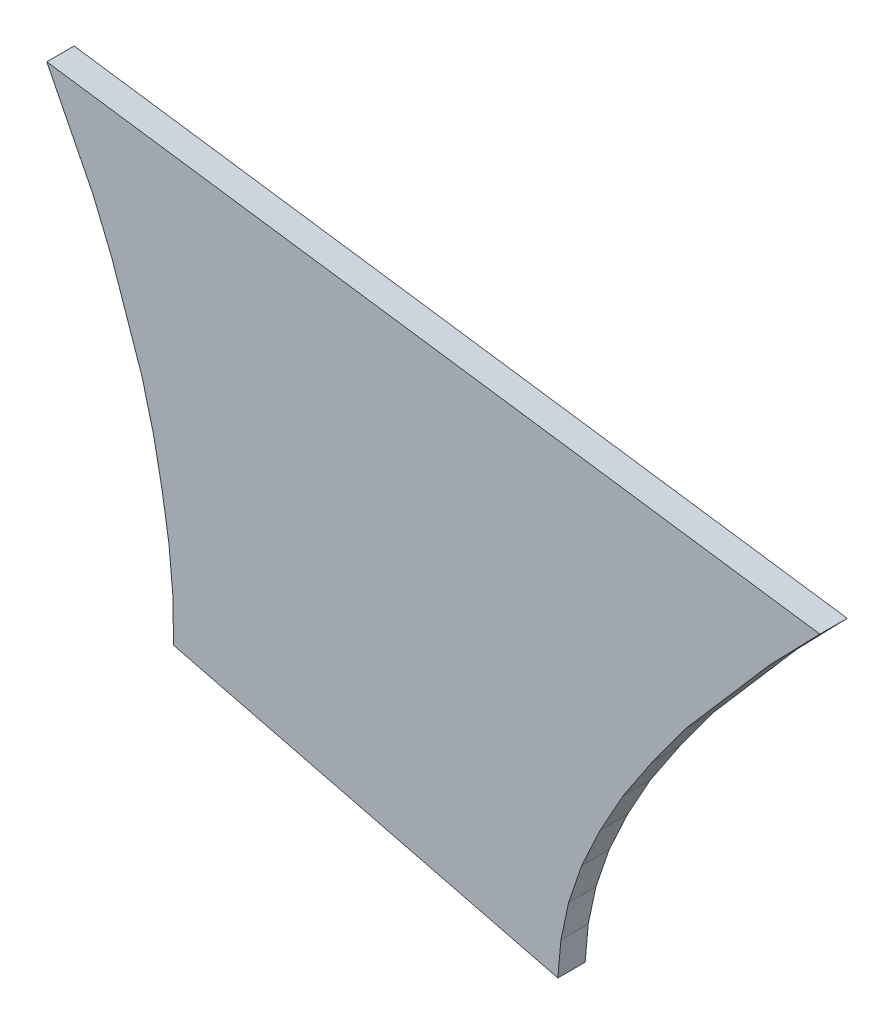
ISO-10303-21;
HEADER;
FILE_DESCRIPTION(('STEP AP214'),'2;1');
FILE_NAME('part.step','',(''),(''),'','','');
FILE_SCHEMA(('AUTOMOTIVE_DESIGN { 1 0 10303 214 1 1 1 1 }'));
ENDSEC;
DATA;
#1=APPLICATION_CONTEXT('core data for automotive mechanical design processes');
#2=APPLICATION_PROTOCOL_DEFINITION('international standard','automotive_design',2000,#1);
#3=PRODUCT_CONTEXT('',#1,'mechanical');
#4=PRODUCT('Part','Part','',(#3));
#5=PRODUCT_RELATED_PRODUCT_CATEGORY('part','',(#4));
#6=PRODUCT_DEFINITION_FORMATION('','',#4);
#7=PRODUCT_DEFINITION_CONTEXT('part definition',#1,'design');
#8=PRODUCT_DEFINITION('design','',#6,#7);
#9=PRODUCT_DEFINITION_SHAPE('','',#8);
#10=(LENGTH_UNIT() NAMED_UNIT(*) SI_UNIT(.MILLI.,.METRE.));
#11=(NAMED_UNIT(*) PLANE_ANGLE_UNIT() SI_UNIT($,.RADIAN.));
#12=(NAMED_UNIT(*) SI_UNIT($,.STERADIAN.) SOLID_ANGLE_UNIT());
#13=UNCERTAINTY_MEASURE_WITH_UNIT(LENGTH_MEASURE(1.E-05),#10,'distance_accuracy_value','');
#14=(GEOMETRIC_REPRESENTATION_CONTEXT(3) GLOBAL_UNCERTAINTY_ASSIGNED_CONTEXT((#13)) GLOBAL_UNIT_ASSIGNED_CONTEXT((#10,
#11,#12)) REPRESENTATION_CONTEXT('',''));
#15=CARTESIAN_POINT('',(0.,0.,0.));
#16=DIRECTION('',(0.,0.,1.));
#17=DIRECTION('',(1.,0.,0.));
#18=AXIS2_PLACEMENT_3D('',#15,#16,#17);
#19=CARTESIAN_POINT('',(89.1480026245117,104.810997009277,0.));
#20=DIRECTION('',(-0.996077933740021,0.0884802233056062,0.));
#21=DIRECTION('',(0.0884802233056062,0.996077933740021,0.));
#22=AXIS2_PLACEMENT_3D('',#19,#20,#21);
#23=PLANE('',#22);
#24=DIRECTION('',(0.0884802233056062,0.996077933740021,0.));
#25=VECTOR('',#24,1.);
#26=CARTESIAN_POINT('',(89.1480026245117,104.810997009277,0.03556));
#27=LINE('',#26,#25);
#28=CARTESIAN_POINT('',(89.1480026245117,104.810997009277,0.03556));
#29=VERTEX_POINT('',#28);
#30=CARTESIAN_POINT('',(89.1520004272461,104.856002807617,0.03556));
#31=VERTEX_POINT('',#30);
#32=EDGE_CURVE('E11',#29,#31,#27,.T.);
#33=ORIENTED_EDGE('',*,*,#32,.F.);
#34=DIRECTION('',(0.,0.,1.));
#35=VECTOR('',#34,1.);
#36=CARTESIAN_POINT('',(89.1480026245117,104.810997009277,0.));
#37=LINE('',#36,#35);
#38=CARTESIAN_POINT('',(89.1480026245117,104.810997009277,0.));
#39=VERTEX_POINT('',#38);
#40=EDGE_CURVE('E24',#39,#29,#37,.T.);
#41=ORIENTED_EDGE('',*,*,#40,.F.);
#42=DIRECTION('',(0.0884802233056062,0.996077933740021,0.));
#43=VECTOR('',#42,1.);
#44=CARTESIAN_POINT('',(89.1480026245117,104.810997009277,0.));
#45=LINE('',#44,#43);
#46=CARTESIAN_POINT('',(89.1520004272461,104.856002807617,0.));
#47=VERTEX_POINT('',#46);
#48=EDGE_CURVE('E166',#39,#47,#45,.T.);
#49=ORIENTED_EDGE('',*,*,#48,.T.);
#50=DIRECTION('',(0.,0.,1.));
#51=VECTOR('',#50,1.);
#52=CARTESIAN_POINT('',(89.1520004272461,104.856002807617,0.));
#53=LINE('',#52,#51);
#54=EDGE_CURVE('E37',#47,#31,#53,.T.);
#55=ORIENTED_EDGE('',*,*,#54,.T.);
#56=EDGE_LOOP('',(#33,#41,#49,#55));
#57=FACE_BOUND('',#56,.T.);
#58=ADVANCED_FACE('F17',(#57),#23,.F.);
#59=CARTESIAN_POINT('',(89.1520004272461,104.856002807617,0.));
#60=DIRECTION('',(-0.978094237159911,0.208162588460494,0.));
#61=DIRECTION('',(0.208162588460494,0.978094237159911,0.));
#62=AXIS2_PLACEMENT_3D('',#59,#60,#61);
#63=PLANE('',#62);
#64=DIRECTION('',(0.208162588460494,0.978094237159911,0.));
#65=VECTOR('',#64,1.);
#66=CARTESIAN_POINT('',(89.1520004272461,104.856002807617,0.03556));
#67=LINE('',#66,#65);
#68=CARTESIAN_POINT('',(89.1620025634766,104.90299987793,0.03556));
#69=VERTEX_POINT('',#68);
#70=EDGE_CURVE('E294',#31,#69,#67,.T.);
#71=ORIENTED_EDGE('',*,*,#70,.F.);
#72=ORIENTED_EDGE('',*,*,#54,.F.);
#73=DIRECTION('',(0.208162588460494,0.978094237159911,0.));
#74=VECTOR('',#73,1.);
#75=CARTESIAN_POINT('',(89.1520004272461,104.856002807617,0.));
#76=LINE('',#75,#74);
#77=CARTESIAN_POINT('',(89.1620025634766,104.90299987793,0.));
#78=VERTEX_POINT('',#77);
#79=EDGE_CURVE('E291',#47,#78,#76,.T.);
#80=ORIENTED_EDGE('',*,*,#79,.T.);
#81=DIRECTION('',(0.,0.,1.));
#82=VECTOR('',#81,1.);
#83=CARTESIAN_POINT('',(89.1620025634766,104.90299987793,0.));
#84=LINE('',#83,#82);
#85=EDGE_CURVE('E289',#78,#69,#84,.T.);
#86=ORIENTED_EDGE('',*,*,#85,.T.);
#87=EDGE_LOOP('',(#71,#72,#80,#86));
#88=FACE_BOUND('',#87,.T.);
#89=ADVANCED_FACE('F302',(#88),#63,.F.);
#90=CARTESIAN_POINT('',(89.1620025634766,104.90299987793,0.));
#91=DIRECTION('',(-0.946788593315352,0.321856116250626,0.));
#92=DIRECTION('',(0.321856116250626,0.946788593315352,0.));
#93=AXIS2_PLACEMENT_3D('',#90,#91,#92);
#94=PLANE('',#93);
#95=DIRECTION('',(0.321856116250626,0.946788593315352,0.));
#96=VECTOR('',#95,1.);
#97=CARTESIAN_POINT('',(89.1620025634766,104.90299987793,0.03556));
#98=LINE('',#97,#96);
#99=CARTESIAN_POINT('',(89.1790008544922,104.953002929688,0.03556));
#100=VERTEX_POINT('',#99);
#101=EDGE_CURVE('E286',#69,#100,#98,.T.);
#102=ORIENTED_EDGE('',*,*,#101,.F.);
#103=ORIENTED_EDGE('',*,*,#85,.F.);
#104=DIRECTION('',(0.321856116250626,0.946788593315352,0.));
#105=VECTOR('',#104,1.);
#106=CARTESIAN_POINT('',(89.1620025634766,104.90299987793,0.));
#107=LINE('',#106,#105);
#108=CARTESIAN_POINT('',(89.1790008544922,104.953002929688,0.));
#109=VERTEX_POINT('',#108);
#110=EDGE_CURVE('E283',#78,#109,#107,.T.);
#111=ORIENTED_EDGE('',*,*,#110,.T.);
#112=DIRECTION('',(0.,0.,1.));
#113=VECTOR('',#112,1.);
#114=CARTESIAN_POINT('',(89.1790008544922,104.953002929688,0.));
#115=LINE('',#114,#113);
#116=EDGE_CURVE('E281',#109,#100,#115,.T.);
#117=ORIENTED_EDGE('',*,*,#116,.T.);
#118=EDGE_LOOP('',(#102,#103,#111,#117));
#119=FACE_BOUND('',#118,.T.);
#120=ADVANCED_FACE('F308',(#119),#94,.F.);
#121=CARTESIAN_POINT('',(89.1790008544922,104.953002929688,0.));
#122=DIRECTION('',(-0.907928187844985,0.419125763603863,0.));
#123=DIRECTION('',(0.419125763603863,0.907928187844985,0.));
#124=AXIS2_PLACEMENT_3D('',#121,#122,#123);
#125=PLANE('',#124);
#126=DIRECTION('',(0.419125763603863,0.907928187844985,0.));
#127=VECTOR('',#126,1.);
#128=CARTESIAN_POINT('',(89.1790008544922,104.953002929688,0.03556));
#129=LINE('',#128,#127);
#130=CARTESIAN_POINT('',(89.2030029296875,105.004997253418,0.03556));
#131=VERTEX_POINT('',#130);
#132=EDGE_CURVE('E278',#100,#131,#129,.T.);
#133=ORIENTED_EDGE('',*,*,#132,.F.);
#134=ORIENTED_EDGE('',*,*,#116,.F.);
#135=DIRECTION('',(0.419125763603863,0.907928187844985,0.));
#136=VECTOR('',#135,1.);
#137=CARTESIAN_POINT('',(89.1790008544922,104.953002929688,0.));
#138=LINE('',#137,#136);
#139=CARTESIAN_POINT('',(89.2030029296875,105.004997253418,0.));
#140=VERTEX_POINT('',#139);
#141=EDGE_CURVE('E275',#109,#140,#138,.T.);
#142=ORIENTED_EDGE('',*,*,#141,.T.);
#143=DIRECTION('',(0.,0.,1.));
#144=VECTOR('',#143,1.);
#145=CARTESIAN_POINT('',(89.2030029296875,105.004997253418,0.));
#146=LINE('',#145,#144);
#147=EDGE_CURVE('E273',#140,#131,#146,.T.);
#148=ORIENTED_EDGE('',*,*,#147,.T.);
#149=EDGE_LOOP('',(#133,#134,#142,#148));
#150=FACE_BOUND('',#149,.T.);
#151=ADVANCED_FACE('F310',(#150),#125,.F.);
#152=CARTESIAN_POINT('',(89.2030029296875,105.004997253418,0.));
#153=DIRECTION('',(-0.874168927292209,0.485621958478803,0.));
#154=DIRECTION('',(0.485621958478803,0.874168927292209,0.));
#155=AXIS2_PLACEMENT_3D('',#152,#153,#154);
#156=PLANE('',#155);
#157=DIRECTION('',(0.485621958478803,0.874168927292209,0.));
#158=VECTOR('',#157,1.);
#159=CARTESIAN_POINT('',(89.2030029296875,105.004997253418,0.03556));
#160=LINE('',#159,#158);
#161=CARTESIAN_POINT('',(89.2330017089844,105.05899810791,0.03556));
#162=VERTEX_POINT('',#161);
#163=EDGE_CURVE('E270',#131,#162,#160,.T.);
#164=ORIENTED_EDGE('',*,*,#163,.F.);
#165=ORIENTED_EDGE('',*,*,#147,.F.);
#166=DIRECTION('',(0.485621958478803,0.874168927292209,0.));
#167=VECTOR('',#166,1.);
#168=CARTESIAN_POINT('',(89.2030029296875,105.004997253418,0.));
#169=LINE('',#168,#167);
#170=CARTESIAN_POINT('',(89.2330017089844,105.05899810791,0.));
#171=VERTEX_POINT('',#170);
#172=EDGE_CURVE('E267',#140,#171,#169,.T.);
#173=ORIENTED_EDGE('',*,*,#172,.T.);
#174=DIRECTION('',(0.,0.,1.));
#175=VECTOR('',#174,1.);
#176=CARTESIAN_POINT('',(89.2330017089844,105.05899810791,0.));
#177=LINE('',#176,#175);
#178=EDGE_CURVE('E265',#171,#162,#177,.T.);
#179=ORIENTED_EDGE('',*,*,#178,.T.);
#180=EDGE_LOOP('',(#164,#165,#173,#179));
#181=FACE_BOUND('',#180,.T.);
#182=ADVANCED_FACE('F315',(#181),#156,.F.);
#183=CARTESIAN_POINT('',(89.2330017089844,105.05899810791,0.));
#184=DIRECTION('',(-0.83203316034414,0.554725896355797,0.));
#185=DIRECTION('',(0.554725896355797,0.83203316034414,0.));
#186=AXIS2_PLACEMENT_3D('',#183,#184,#185);
#187=PLANE('',#186);
#188=DIRECTION('',(0.554725896355797,0.83203316034414,0.));
#189=VECTOR('',#188,1.);
#190=CARTESIAN_POINT('',(89.2330017089844,105.05899810791,0.03556));
#191=LINE('',#190,#189);
#192=CARTESIAN_POINT('',(89.2710037231445,105.115997314453,0.03556));
#193=VERTEX_POINT('',#192);
#194=EDGE_CURVE('E262',#162,#193,#191,.T.);
#195=ORIENTED_EDGE('',*,*,#194,.F.);
#196=ORIENTED_EDGE('',*,*,#178,.F.);
#197=DIRECTION('',(0.554725896355797,0.83203316034414,0.));
#198=VECTOR('',#197,1.);
#199=CARTESIAN_POINT('',(89.2330017089844,105.05899810791,0.));
#200=LINE('',#199,#198);
#201=CARTESIAN_POINT('',(89.2710037231445,105.115997314453,0.));
#202=VERTEX_POINT('',#201);
#203=EDGE_CURVE('E259',#171,#202,#200,.T.);
#204=ORIENTED_EDGE('',*,*,#203,.T.);
#205=DIRECTION('',(0.,0.,1.));
#206=VECTOR('',#205,1.);
#207=CARTESIAN_POINT('',(89.2710037231445,105.115997314453,0.));
#208=LINE('',#207,#206);
#209=EDGE_CURVE('E257',#202,#193,#208,.T.);
#210=ORIENTED_EDGE('',*,*,#209,.T.);
#211=EDGE_LOOP('',(#195,#196,#204,#210));
#212=FACE_BOUND('',#211,.T.);
#213=ADVANCED_FACE('F318',(#212),#187,.F.);
#214=CARTESIAN_POINT('',(89.2710037231445,105.115997314453,0.));
#215=DIRECTION('',(-0.806437592455541,0.591319211149537,0.));
#216=DIRECTION('',(0.591319211149537,0.806437592455541,0.));
#217=AXIS2_PLACEMENT_3D('',#214,#215,#216);
#218=PLANE('',#217);
#219=DIRECTION('',(0.591319211149537,0.806437592455541,0.));
#220=VECTOR('',#219,1.);
#221=CARTESIAN_POINT('',(89.2710037231445,105.115997314453,0.03556));
#222=LINE('',#221,#220);
#223=CARTESIAN_POINT('',(89.3150024414062,105.176002502441,0.03556));
#224=VERTEX_POINT('',#223);
#225=EDGE_CURVE('E254',#193,#224,#222,.T.);
#226=ORIENTED_EDGE('',*,*,#225,.F.);
#227=ORIENTED_EDGE('',*,*,#209,.F.);
#228=DIRECTION('',(0.591319211149537,0.806437592455541,0.));
#229=VECTOR('',#228,1.);
#230=CARTESIAN_POINT('',(89.2710037231445,105.115997314453,0.));
#231=LINE('',#230,#229);
#232=CARTESIAN_POINT('',(89.3150024414062,105.176002502441,0.));
#233=VERTEX_POINT('',#232);
#234=EDGE_CURVE('E251',#202,#233,#231,.T.);
#235=ORIENTED_EDGE('',*,*,#234,.T.);
#236=DIRECTION('',(0.,0.,1.));
#237=VECTOR('',#236,1.);
#238=CARTESIAN_POINT('',(89.3150024414062,105.176002502441,0.));
#239=LINE('',#238,#237);
#240=EDGE_CURVE('E249',#233,#224,#239,.T.);
#241=ORIENTED_EDGE('',*,*,#240,.T.);
#242=EDGE_LOOP('',(#226,#227,#235,#241));
#243=FACE_BOUND('',#242,.T.);
#244=ADVANCED_FACE('F323',(#243),#218,.F.);
#245=CARTESIAN_POINT('',(89.3150024414062,105.176002502441,0.));
#246=DIRECTION('',(-0.756278047346252,0.654250345893787,0.));
#247=DIRECTION('',(0.654250345893787,0.756278047346252,0.));
#248=AXIS2_PLACEMENT_3D('',#245,#246,#247);
#249=PLANE('',#248);
#250=DIRECTION('',(0.654250345893787,0.756278047346252,0.));
#251=VECTOR('',#250,1.);
#252=CARTESIAN_POINT('',(89.3150024414062,105.176002502441,0.03556));
#253=LINE('',#252,#251);
#254=CARTESIAN_POINT('',(89.4240036010742,105.302001953125,0.03556));
#255=VERTEX_POINT('',#254);
#256=EDGE_CURVE('E246',#224,#255,#253,.T.);
#257=ORIENTED_EDGE('',*,*,#256,.F.);
#258=ORIENTED_EDGE('',*,*,#240,.F.);
#259=DIRECTION('',(0.654250345893787,0.756278047346252,0.));
#260=VECTOR('',#259,1.);
#261=CARTESIAN_POINT('',(89.3150024414062,105.176002502441,0.));
#262=LINE('',#261,#260);
#263=CARTESIAN_POINT('',(89.4240036010742,105.302001953125,0.));
#264=VERTEX_POINT('',#263);
#265=EDGE_CURVE('E243',#233,#264,#262,.T.);
#266=ORIENTED_EDGE('',*,*,#265,.T.);
#267=DIRECTION('',(0.,0.,1.));
#268=VECTOR('',#267,1.);
#269=CARTESIAN_POINT('',(89.4240036010742,105.302001953125,0.));
#270=LINE('',#269,#268);
#271=EDGE_CURVE('E241',#264,#255,#270,.T.);
#272=ORIENTED_EDGE('',*,*,#271,.T.);
#273=EDGE_LOOP('',(#257,#258,#266,#272));
#274=FACE_BOUND('',#273,.T.);
#275=ADVANCED_FACE('F326',(#274),#249,.F.);
#276=CARTESIAN_POINT('',(89.4240036010742,105.302001953125,0.));
#277=DIRECTION('',(-0.71777288988445,0.696277300037079,0.));
#278=DIRECTION('',(0.696277300037079,0.71777288988445,0.));
#279=AXIS2_PLACEMENT_3D('',#276,#277,#278);
#280=PLANE('',#279);
#281=DIRECTION('',(0.696277300037079,0.71777288988445,0.));
#282=VECTOR('',#281,1.);
#283=CARTESIAN_POINT('',(89.4240036010742,105.302001953125,0.03556));
#284=LINE('',#283,#282);
#285=CARTESIAN_POINT('',(89.4889984130859,105.369003295898,0.03556));
#286=VERTEX_POINT('',#285);
#287=EDGE_CURVE('E238',#255,#286,#284,.T.);
#288=ORIENTED_EDGE('',*,*,#287,.F.);
#289=ORIENTED_EDGE('',*,*,#271,.F.);
#290=DIRECTION('',(0.696277300037079,0.71777288988445,0.));
#291=VECTOR('',#290,1.);
#292=CARTESIAN_POINT('',(89.4240036010742,105.302001953125,0.));
#293=LINE('',#292,#291);
#294=CARTESIAN_POINT('',(89.4889984130859,105.369003295898,0.));
#295=VERTEX_POINT('',#294);
#296=EDGE_CURVE('E235',#264,#295,#293,.T.);
#297=ORIENTED_EDGE('',*,*,#296,.T.);
#298=DIRECTION('',(0.,0.,1.));
#299=VECTOR('',#298,1.);
#300=CARTESIAN_POINT('',(89.4889984130859,105.369003295898,0.));
#301=LINE('',#300,#299);
#302=EDGE_CURVE('E233',#295,#286,#301,.T.);
#303=ORIENTED_EDGE('',*,*,#302,.T.);
#304=EDGE_LOOP('',(#288,#289,#297,#303));
#305=FACE_BOUND('',#304,.T.);
#306=ADVANCED_FACE('F331',(#305),#280,.F.);
#307=CARTESIAN_POINT('',(89.4889984130859,105.369003295898,0.));
#308=DIRECTION('',(-0.139766370487865,-0.990184508907632,0.));
#309=DIRECTION('',(-0.990184508907632,0.139766370487865,0.));
#310=AXIS2_PLACEMENT_3D('',#307,#308,#309);
#311=PLANE('',#310);
#312=DIRECTION('',(-0.990184508907632,0.139766370487865,0.));
#313=VECTOR('',#312,1.);
#314=CARTESIAN_POINT('',(89.4889984130859,105.369003295898,0.03556));
#315=LINE('',#314,#313);
#316=CARTESIAN_POINT('',(88.4830017089844,105.511001586914,0.03556));
#317=VERTEX_POINT('',#316);
#318=EDGE_CURVE('E230',#286,#317,#315,.T.);
#319=ORIENTED_EDGE('',*,*,#318,.F.);
#320=ORIENTED_EDGE('',*,*,#302,.F.);
#321=DIRECTION('',(-0.990184508907632,0.139766370487865,0.));
#322=VECTOR('',#321,1.);
#323=CARTESIAN_POINT('',(89.4889984130859,105.369003295898,0.));
#324=LINE('',#323,#322);
#325=CARTESIAN_POINT('',(88.4830017089844,105.511001586914,0.));
#326=VERTEX_POINT('',#325);
#327=EDGE_CURVE('E227',#295,#326,#324,.T.);
#328=ORIENTED_EDGE('',*,*,#327,.T.);
#329=DIRECTION('',(0.,0.,1.));
#330=VECTOR('',#329,1.);
#331=CARTESIAN_POINT('',(88.4830017089844,105.511001586914,0.));
#332=LINE('',#331,#330);
#333=EDGE_CURVE('E225',#326,#317,#332,.T.);
#334=ORIENTED_EDGE('',*,*,#333,.T.);
#335=EDGE_LOOP('',(#319,#320,#328,#334));
#336=FACE_BOUND('',#335,.T.);
#337=ADVANCED_FACE('F334',(#336),#311,.F.);
#338=CARTESIAN_POINT('',(88.4830017089844,105.511001586914,0.));
#339=DIRECTION('',(0.892933823393983,0.450187946350191,0.));
#340=DIRECTION('',(0.450187946350191,-0.892933823393983,0.));
#341=AXIS2_PLACEMENT_3D('',#338,#339,#340);
#342=PLANE('',#341);
#343=DIRECTION('',(0.450187946350191,-0.892933823393983,0.));
#344=VECTOR('',#343,1.);
#345=CARTESIAN_POINT('',(88.4830017089844,105.511001586914,0.03556));
#346=LINE('',#345,#344);
#347=CARTESIAN_POINT('',(88.5429992675781,105.391998291016,0.03556));
#348=VERTEX_POINT('',#347);
#349=EDGE_CURVE('E222',#317,#348,#346,.T.);
#350=ORIENTED_EDGE('',*,*,#349,.F.);
#351=ORIENTED_EDGE('',*,*,#333,.F.);
#352=DIRECTION('',(0.450187946350191,-0.892933823393983,0.));
#353=VECTOR('',#352,1.);
#354=CARTESIAN_POINT('',(88.4830017089844,105.511001586914,0.));
#355=LINE('',#354,#353);
#356=CARTESIAN_POINT('',(88.5429992675781,105.391998291016,0.));
#357=VERTEX_POINT('',#356);
#358=EDGE_CURVE('E219',#326,#357,#355,.T.);
#359=ORIENTED_EDGE('',*,*,#358,.T.);
#360=DIRECTION('',(0.,0.,1.));
#361=VECTOR('',#360,1.);
#362=CARTESIAN_POINT('',(88.5429992675781,105.391998291016,0.));
#363=LINE('',#362,#361);
#364=EDGE_CURVE('E217',#357,#348,#363,.T.);
#365=ORIENTED_EDGE('',*,*,#364,.T.);
#366=EDGE_LOOP('',(#350,#351,#359,#365));
#367=FACE_BOUND('',#366,.T.);
#368=ADVANCED_FACE('F339',(#367),#342,.F.);
#369=CARTESIAN_POINT('',(88.5429992675781,105.391998291016,0.));
#370=DIRECTION('',(0.924002023944869,0.382387577917727,0.));
#371=DIRECTION('',(0.382387577917727,-0.924002023944869,0.));
#372=AXIS2_PLACEMENT_3D('',#369,#370,#371);
#373=PLANE('',#372);
#374=DIRECTION('',(0.382387577917727,-0.924002023944869,0.));
#375=VECTOR('',#374,1.);
#376=CARTESIAN_POINT('',(88.5429992675781,105.391998291016,0.03556));
#377=LINE('',#376,#375);
#378=CARTESIAN_POINT('',(88.5670013427734,105.333999633789,0.03556));
#379=VERTEX_POINT('',#378);
#380=EDGE_CURVE('E214',#348,#379,#377,.T.);
#381=ORIENTED_EDGE('',*,*,#380,.F.);
#382=ORIENTED_EDGE('',*,*,#364,.F.);
#383=DIRECTION('',(0.382387577917727,-0.924002023944869,0.));
#384=VECTOR('',#383,1.);
#385=CARTESIAN_POINT('',(88.5429992675781,105.391998291016,0.));
#386=LINE('',#385,#384);
#387=CARTESIAN_POINT('',(88.5670013427734,105.333999633789,0.));
#388=VERTEX_POINT('',#387);
#389=EDGE_CURVE('E211',#357,#388,#386,.T.);
#390=ORIENTED_EDGE('',*,*,#389,.T.);
#391=DIRECTION('',(0.,0.,1.));
#392=VECTOR('',#391,1.);
#393=CARTESIAN_POINT('',(88.5670013427734,105.333999633789,0.));
#394=LINE('',#393,#392);
#395=EDGE_CURVE('E209',#388,#379,#394,.T.);
#396=ORIENTED_EDGE('',*,*,#395,.T.);
#397=EDGE_LOOP('',(#381,#382,#390,#396));
#398=FACE_BOUND('',#397,.T.);
#399=ADVANCED_FACE('F342',(#398),#373,.F.);
#400=CARTESIAN_POINT('',(88.5670013427734,105.333999633789,0.));
#401=DIRECTION('',(0.945368356106391,0.326004097018272,0.));
#402=DIRECTION('',(0.326004097018272,-0.945368356106391,0.));
#403=AXIS2_PLACEMENT_3D('',#400,#401,#402);
#404=PLANE('',#403);
#405=DIRECTION('',(0.326004097018272,-0.945368356106391,0.));
#406=VECTOR('',#405,1.);
#407=CARTESIAN_POINT('',(88.5670013427734,105.333999633789,0.03556));
#408=LINE('',#407,#406);
#409=CARTESIAN_POINT('',(88.6070022583008,105.218002319336,0.03556));
#410=VERTEX_POINT('',#409);
#411=EDGE_CURVE('E206',#379,#410,#408,.T.);
#412=ORIENTED_EDGE('',*,*,#411,.F.);
#413=ORIENTED_EDGE('',*,*,#395,.F.);
#414=DIRECTION('',(0.326004097018272,-0.945368356106391,0.));
#415=VECTOR('',#414,1.);
#416=CARTESIAN_POINT('',(88.5670013427734,105.333999633789,0.));
#417=LINE('',#416,#415);
#418=CARTESIAN_POINT('',(88.6070022583008,105.218002319336,0.));
#419=VERTEX_POINT('',#418);
#420=EDGE_CURVE('E203',#388,#419,#417,.T.);
#421=ORIENTED_EDGE('',*,*,#420,.T.);
#422=DIRECTION('',(0.,0.,1.));
#423=VECTOR('',#422,1.);
#424=CARTESIAN_POINT('',(88.6070022583008,105.218002319336,0.));
#425=LINE('',#424,#423);
#426=EDGE_CURVE('E201',#419,#410,#425,.T.);
#427=ORIENTED_EDGE('',*,*,#426,.T.);
#428=EDGE_LOOP('',(#412,#413,#421,#427));
#429=FACE_BOUND('',#428,.T.);
#430=ADVANCED_FACE('F347',(#429),#404,.F.);
#431=CARTESIAN_POINT('',(88.6070022583008,105.218002319336,0.));
#432=DIRECTION('',(0.968147976142087,0.250378705747875,0.));
#433=DIRECTION('',(0.250378705747875,-0.968147976142087,0.));
#434=AXIS2_PLACEMENT_3D('',#431,#432,#433);
#435=PLANE('',#434);
#436=DIRECTION('',(0.250378705747875,-0.968147976142087,0.));
#437=VECTOR('',#436,1.);
#438=CARTESIAN_POINT('',(88.6070022583008,105.218002319336,0.03556));
#439=LINE('',#438,#437);
#440=CARTESIAN_POINT('',(88.6220016479492,105.160003662109,0.03556));
#441=VERTEX_POINT('',#440);
#442=EDGE_CURVE('E198',#410,#441,#439,.T.);
#443=ORIENTED_EDGE('',*,*,#442,.F.);
#444=ORIENTED_EDGE('',*,*,#426,.F.);
#445=DIRECTION('',(0.250378705747875,-0.968147976142087,0.));
#446=VECTOR('',#445,1.);
#447=CARTESIAN_POINT('',(88.6070022583008,105.218002319336,0.));
#448=LINE('',#447,#446);
#449=CARTESIAN_POINT('',(88.6220016479492,105.160003662109,0.));
#450=VERTEX_POINT('',#449);
#451=EDGE_CURVE('E195',#419,#450,#448,.T.);
#452=ORIENTED_EDGE('',*,*,#451,.T.);
#453=DIRECTION('',(0.,0.,1.));
#454=VECTOR('',#453,1.);
#455=CARTESIAN_POINT('',(88.6220016479492,105.160003662109,0.));
#456=LINE('',#455,#454);
#457=EDGE_CURVE('E193',#450,#441,#456,.T.);
#458=ORIENTED_EDGE('',*,*,#457,.T.);
#459=EDGE_LOOP('',(#443,#444,#452,#458));
#460=FACE_BOUND('',#459,.T.);
#461=ADVANCED_FACE('F350',(#460),#435,.F.);
#462=CARTESIAN_POINT('',(88.6220016479492,105.160003662109,0.));
#463=DIRECTION('',(0.981248369079838,0.19274760226306,0.));
#464=DIRECTION('',(0.19274760226306,-0.981248369079838,0.));
#465=AXIS2_PLACEMENT_3D('',#462,#463,#464);
#466=PLANE('',#465);
#467=DIRECTION('',(0.19274760226306,-0.981248369079837,0.));
#468=VECTOR('',#467,1.);
#469=CARTESIAN_POINT('',(88.6220016479492,105.160003662109,0.03556));
#470=LINE('',#469,#468);
#471=CARTESIAN_POINT('',(88.6330032348633,105.103996276855,0.03556));
#472=VERTEX_POINT('',#471);
#473=EDGE_CURVE('E190',#441,#472,#470,.T.);
#474=ORIENTED_EDGE('',*,*,#473,.F.);
#475=ORIENTED_EDGE('',*,*,#457,.F.);
#476=DIRECTION('',(0.19274760226306,-0.981248369079837,0.));
#477=VECTOR('',#476,1.);
#478=CARTESIAN_POINT('',(88.6220016479492,105.160003662109,0.));
#479=LINE('',#478,#477);
#480=CARTESIAN_POINT('',(88.6330032348633,105.103996276855,0.));
#481=VERTEX_POINT('',#480);
#482=EDGE_CURVE('E187',#450,#481,#479,.T.);
#483=ORIENTED_EDGE('',*,*,#482,.T.);
#484=DIRECTION('',(0.,0.,1.));
#485=VECTOR('',#484,1.);
#486=CARTESIAN_POINT('',(88.6330032348633,105.103996276855,0.));
#487=LINE('',#486,#485);
#488=EDGE_CURVE('E185',#481,#472,#487,.T.);
#489=ORIENTED_EDGE('',*,*,#488,.T.);
#490=EDGE_LOOP('',(#474,#475,#483,#489));
#491=FACE_BOUND('',#490,.T.);
#492=ADVANCED_FACE('F355',(#491),#466,.F.);
#493=CARTESIAN_POINT('',(88.6330032348633,105.103996276855,0.));
#494=DIRECTION('',(0.987775826099441,0.155881100116616,0.));
#495=DIRECTION('',(0.155881100116616,-0.987775826099441,0.));
#496=AXIS2_PLACEMENT_3D('',#493,#494,#495);
#497=PLANE('',#496);
#498=DIRECTION('',(0.155881100116616,-0.987775826099441,0.));
#499=VECTOR('',#498,1.);
#500=CARTESIAN_POINT('',(88.6330032348633,105.103996276855,0.03556));
#501=LINE('',#500,#499);
#502=CARTESIAN_POINT('',(88.6419982910156,105.046997070313,0.03556));
#503=VERTEX_POINT('',#502);
#504=EDGE_CURVE('E182',#472,#503,#501,.T.);
#505=ORIENTED_EDGE('',*,*,#504,.F.);
#506=ORIENTED_EDGE('',*,*,#488,.F.);
#507=DIRECTION('',(0.155881100116616,-0.987775826099441,0.));
#508=VECTOR('',#507,1.);
#509=CARTESIAN_POINT('',(88.6330032348633,105.103996276855,0.));
#510=LINE('',#509,#508);
#511=CARTESIAN_POINT('',(88.6419982910156,105.046997070313,0.));
#512=VERTEX_POINT('',#511);
#513=EDGE_CURVE('E179',#481,#512,#510,.T.);
#514=ORIENTED_EDGE('',*,*,#513,.T.);
#515=DIRECTION('',(0.,0.,1.));
#516=VECTOR('',#515,1.);
#517=CARTESIAN_POINT('',(88.6419982910156,105.046997070313,0.));
#518=LINE('',#517,#516);
#519=EDGE_CURVE('E177',#512,#503,#518,.T.);
#520=ORIENTED_EDGE('',*,*,#519,.T.);
#521=EDGE_LOOP('',(#505,#506,#514,#520));
#522=FACE_BOUND('',#521,.T.);
#523=ADVANCED_FACE('F358',(#522),#497,.F.);
#524=CARTESIAN_POINT('',(88.6419982910156,105.046997070313,0.));
#525=DIRECTION('',(0.995885276314695,0.0906229353949841,0.));
#526=DIRECTION('',(0.0906229353949841,-0.995885276314695,0.));
#527=AXIS2_PLACEMENT_3D('',#524,#525,#526);
#528=PLANE('',#527);
#529=DIRECTION('',(0.090622935394984,-0.995885276314695,0.));
#530=VECTOR('',#529,1.);
#531=CARTESIAN_POINT('',(88.6419982910156,105.046997070313,0.03556));
#532=LINE('',#531,#530);
#533=CARTESIAN_POINT('',(88.6470031738281,104.991996765137,0.03556));
#534=VERTEX_POINT('',#533);
#535=EDGE_CURVE('E174',#503,#534,#532,.T.);
#536=ORIENTED_EDGE('',*,*,#535,.F.);
#537=ORIENTED_EDGE('',*,*,#519,.F.);
#538=DIRECTION('',(0.090622935394984,-0.995885276314695,0.));
#539=VECTOR('',#538,1.);
#540=CARTESIAN_POINT('',(88.6419982910156,105.046997070313,0.));
#541=LINE('',#540,#539);
#542=CARTESIAN_POINT('',(88.6470031738281,104.991996765137,0.));
#543=VERTEX_POINT('',#542);
#544=EDGE_CURVE('E172',#512,#543,#541,.T.);
#545=ORIENTED_EDGE('',*,*,#544,.T.);
#546=DIRECTION('',(0.,0.,1.));
#547=VECTOR('',#546,1.);
#548=CARTESIAN_POINT('',(88.6470031738281,104.991996765137,0.));
#549=LINE('',#548,#547);
#550=EDGE_CURVE('E157',#543,#534,#549,.T.);
#551=ORIENTED_EDGE('',*,*,#550,.T.);
#552=EDGE_LOOP('',(#536,#537,#545,#551));
#553=FACE_BOUND('',#552,.T.);
#554=ADVANCED_FACE('F361',(#553),#528,.F.);
#555=CARTESIAN_POINT('',(88.6470031738281,104.991996765137,0.));
#556=DIRECTION('',(0.999840772990308,0.0178445696541867,0.));
#557=DIRECTION('',(0.0178445696541867,-0.999840772990308,0.));
#558=AXIS2_PLACEMENT_3D('',#555,#556,#557);
#559=PLANE('',#558);
#560=DIRECTION('',(0.0178445696541867,-0.999840772990308,0.));
#561=VECTOR('',#560,1.);
#562=CARTESIAN_POINT('',(88.6470031738281,104.991996765137,0.03556));
#563=LINE('',#562,#561);
#564=CARTESIAN_POINT('',(88.6480026245117,104.935997009277,0.03556));
#565=VERTEX_POINT('',#564);
#566=EDGE_CURVE('E161',#534,#565,#563,.T.);
#567=ORIENTED_EDGE('',*,*,#566,.F.);
#568=ORIENTED_EDGE('',*,*,#550,.F.);
#569=DIRECTION('',(0.0178445696541867,-0.999840772990308,0.));
#570=VECTOR('',#569,1.);
#571=CARTESIAN_POINT('',(88.6470031738281,104.991996765137,0.));
#572=LINE('',#571,#570);
#573=CARTESIAN_POINT('',(88.6480026245117,104.935997009277,0.));
#574=VERTEX_POINT('',#573);
#575=EDGE_CURVE('E153',#543,#574,#572,.T.);
#576=ORIENTED_EDGE('',*,*,#575,.T.);
#577=DIRECTION('',(0.,0.,1.));
#578=VECTOR('',#577,1.);
#579=CARTESIAN_POINT('',(88.6480026245117,104.935997009277,0.));
#580=LINE('',#579,#578);
#581=EDGE_CURVE('E143',#574,#565,#580,.T.);
#582=ORIENTED_EDGE('',*,*,#581,.T.);
#583=EDGE_LOOP('',(#567,#568,#576,#582));
#584=FACE_BOUND('',#583,.T.);
#585=ADVANCED_FACE('F156',(#584),#559,.F.);
#586=CARTESIAN_POINT('',(88.6480026245117,104.935997009277,0.));
#587=DIRECTION('',(0.242535625036333,0.970142500145332,0.));
#588=DIRECTION('',(0.970142500145332,-0.242535625036333,0.));
#589=AXIS2_PLACEMENT_3D('',#586,#587,#588);
#590=PLANE('',#589);
#591=DIRECTION('',(0.970142500145332,-0.242535625036333,0.));
#592=VECTOR('',#591,1.);
#593=CARTESIAN_POINT('',(88.6480026245117,104.935997009277,0.03556));
#594=LINE('',#593,#592);
#595=EDGE_CURVE('E149',#565,#29,#594,.T.);
#596=ORIENTED_EDGE('',*,*,#595,.F.);
#597=ORIENTED_EDGE('',*,*,#581,.F.);
#598=DIRECTION('',(0.970142500145332,-0.242535625036333,0.));
#599=VECTOR('',#598,1.);
#600=CARTESIAN_POINT('',(88.6480026245117,104.935997009277,0.));
#601=LINE('',#600,#599);
#602=EDGE_CURVE('E147',#574,#39,#601,.T.);
#603=ORIENTED_EDGE('',*,*,#602,.T.);
#604=ORIENTED_EDGE('',*,*,#40,.T.);
#605=EDGE_LOOP('',(#596,#597,#603,#604));
#606=FACE_BOUND('',#605,.T.);
#607=ADVANCED_FACE('F145',(#606),#590,.F.);
#608=CARTESIAN_POINT('',(89.1480026245117,104.810997009277,0.));
#609=DIRECTION('',(0.,0.,1.));
#610=DIRECTION('',(1.,0.,0.));
#611=AXIS2_PLACEMENT_3D('',#608,#609,#610);
#612=PLANE('',#611);
#613=ORIENTED_EDGE('',*,*,#602,.F.);
#614=ORIENTED_EDGE('',*,*,#575,.F.);
#615=ORIENTED_EDGE('',*,*,#544,.F.);
#616=ORIENTED_EDGE('',*,*,#513,.F.);
#617=ORIENTED_EDGE('',*,*,#482,.F.);
#618=ORIENTED_EDGE('',*,*,#451,.F.);
#619=ORIENTED_EDGE('',*,*,#420,.F.);
#620=ORIENTED_EDGE('',*,*,#389,.F.);
#621=ORIENTED_EDGE('',*,*,#358,.F.);
#622=ORIENTED_EDGE('',*,*,#327,.F.);
#623=ORIENTED_EDGE('',*,*,#296,.F.);
#624=ORIENTED_EDGE('',*,*,#265,.F.);
#625=ORIENTED_EDGE('',*,*,#234,.F.);
#626=ORIENTED_EDGE('',*,*,#203,.F.);
#627=ORIENTED_EDGE('',*,*,#172,.F.);
#628=ORIENTED_EDGE('',*,*,#141,.F.);
#629=ORIENTED_EDGE('',*,*,#110,.F.);
#630=ORIENTED_EDGE('',*,*,#79,.F.);
#631=ORIENTED_EDGE('',*,*,#48,.F.);
#632=EDGE_LOOP('',(#613,#614,#615,#616,#617,#618,#619,#620,#621,#622,#623,#624,#625,#626,#627,
#628,#629,#630,#631));
#633=FACE_BOUND('',#632,.T.);
#634=ADVANCED_FACE('F164',(#633),#612,.F.);
#635=CARTESIAN_POINT('',(89.1480026245117,104.810997009277,0.03556));
#636=DIRECTION('',(0.,0.,1.));
#637=DIRECTION('',(1.,0.,0.));
#638=AXIS2_PLACEMENT_3D('',#635,#636,#637);
#639=PLANE('',#638);
#640=ORIENTED_EDGE('',*,*,#32,.T.);
#641=ORIENTED_EDGE('',*,*,#70,.T.);
#642=ORIENTED_EDGE('',*,*,#101,.T.);
#643=ORIENTED_EDGE('',*,*,#132,.T.);
#644=ORIENTED_EDGE('',*,*,#163,.T.);
#645=ORIENTED_EDGE('',*,*,#194,.T.);
#646=ORIENTED_EDGE('',*,*,#225,.T.);
#647=ORIENTED_EDGE('',*,*,#256,.T.);
#648=ORIENTED_EDGE('',*,*,#287,.T.);
#649=ORIENTED_EDGE('',*,*,#318,.T.);
#650=ORIENTED_EDGE('',*,*,#349,.T.);
#651=ORIENTED_EDGE('',*,*,#380,.T.);
#652=ORIENTED_EDGE('',*,*,#411,.T.);
#653=ORIENTED_EDGE('',*,*,#442,.T.);
#654=ORIENTED_EDGE('',*,*,#473,.T.);
#655=ORIENTED_EDGE('',*,*,#504,.T.);
#656=ORIENTED_EDGE('',*,*,#535,.T.);
#657=ORIENTED_EDGE('',*,*,#566,.T.);
#658=ORIENTED_EDGE('',*,*,#595,.T.);
#659=EDGE_LOOP('',(#640,#641,#642,#643,#644,#645,#646,#647,#648,#649,#650,#651,#652,#653,#654,
#655,#656,#657,#658));
#660=FACE_BOUND('',#659,.T.);
#661=ADVANCED_FACE('F305',(#660),#639,.T.);
#662=CLOSED_SHELL('',(#58,#89,#120,#151,#182,#213,#244,#275,#306,#337,#368,#399,#430,#461,#492,
#523,#554,#585,#607,#634,#661));
#663=MANIFOLD_SOLID_BREP('B1',#662);
#664=ADVANCED_BREP_SHAPE_REPRESENTATION('',(#18,#663),#14);
#665=SHAPE_DEFINITION_REPRESENTATION(#9,#664);
ENDSEC;
END-ISO-10303-21;
